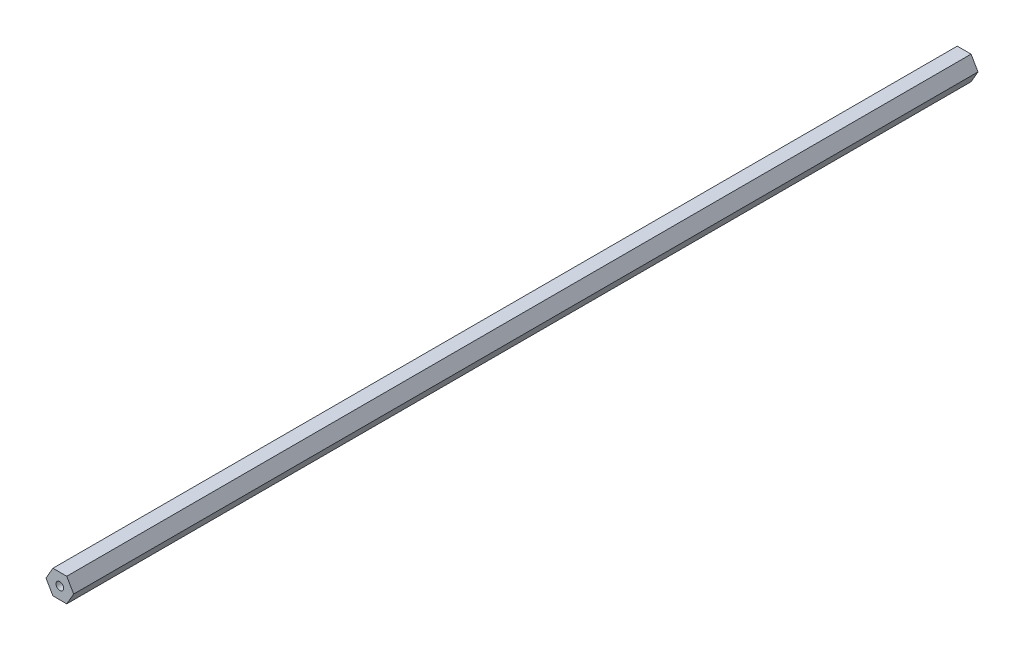
ISO-10303-21;
HEADER;
FILE_DESCRIPTION(('STEP AP214'),'2;1');
FILE_NAME('part.step','',(''),(''),'','','');
FILE_SCHEMA(('AUTOMOTIVE_DESIGN { 1 0 10303 214 1 1 1 1 }'));
ENDSEC;
DATA;
#1=APPLICATION_CONTEXT('core data for automotive mechanical design processes');
#2=APPLICATION_PROTOCOL_DEFINITION('international standard','automotive_design',2000,#1);
#3=PRODUCT_CONTEXT('',#1,'mechanical');
#4=PRODUCT('Part','Part','',(#3));
#5=PRODUCT_RELATED_PRODUCT_CATEGORY('part','',(#4));
#6=PRODUCT_DEFINITION_FORMATION('','',#4);
#7=PRODUCT_DEFINITION_CONTEXT('part definition',#1,'design');
#8=PRODUCT_DEFINITION('design','',#6,#7);
#9=PRODUCT_DEFINITION_SHAPE('','',#8);
#10=(LENGTH_UNIT() NAMED_UNIT(*) SI_UNIT(.MILLI.,.METRE.));
#11=(NAMED_UNIT(*) PLANE_ANGLE_UNIT() SI_UNIT($,.RADIAN.));
#12=(NAMED_UNIT(*) SI_UNIT($,.STERADIAN.) SOLID_ANGLE_UNIT());
#13=UNCERTAINTY_MEASURE_WITH_UNIT(LENGTH_MEASURE(1.E-05),#10,'distance_accuracy_value','');
#14=(GEOMETRIC_REPRESENTATION_CONTEXT(3) GLOBAL_UNCERTAINTY_ASSIGNED_CONTEXT((#13)) GLOBAL_UNIT_ASSIGNED_CONTEXT((#10,
#11,#12)) REPRESENTATION_CONTEXT('',''));
#15=CARTESIAN_POINT('',(0.,0.,0.));
#16=DIRECTION('',(0.,0.,1.));
#17=DIRECTION('',(1.,0.,0.));
#18=AXIS2_PLACEMENT_3D('',#15,#16,#17);
#19=CARTESIAN_POINT('',(0.,0.,479.425));
#20=DIRECTION('',(0.,0.,1.));
#21=DIRECTION('',(1.,0.,0.));
#22=AXIS2_PLACEMENT_3D('',#19,#20,#21);
#23=PLANE('',#22);
#24=DIRECTION('',(0.5,0.866025403784439,0.));
#25=VECTOR('',#24,1.);
#26=CARTESIAN_POINT('',(3.66617420935412,-6.35,479.425));
#27=LINE('',#26,#25);
#28=CARTESIAN_POINT('',(3.66617420935412,-6.35,479.425));
#29=VERTEX_POINT('',#28);
#30=CARTESIAN_POINT('',(7.33234841870825,0.,479.425));
#31=VERTEX_POINT('',#30);
#32=EDGE_CURVE('E129',#29,#31,#27,.T.);
#33=ORIENTED_EDGE('',*,*,#32,.T.);
#34=DIRECTION('',(-0.5,0.866025403784439,0.));
#35=VECTOR('',#34,1.);
#36=CARTESIAN_POINT('',(7.33234841870825,0.,479.425));
#37=LINE('',#36,#35);
#38=CARTESIAN_POINT('',(3.66617420935412,6.35,479.425));
#39=VERTEX_POINT('',#38);
#40=EDGE_CURVE('E87',#31,#39,#37,.T.);
#41=ORIENTED_EDGE('',*,*,#40,.T.);
#42=DIRECTION('',(-1.,0.,0.));
#43=VECTOR('',#42,1.);
#44=CARTESIAN_POINT('',(3.66617420935412,6.35,479.425));
#45=LINE('',#44,#43);
#46=CARTESIAN_POINT('',(-3.66617420935412,6.35,479.425));
#47=VERTEX_POINT('',#46);
#48=EDGE_CURVE('E100',#39,#47,#45,.T.);
#49=ORIENTED_EDGE('',*,*,#48,.T.);
#50=DIRECTION('',(-0.5,-0.866025403784439,0.));
#51=VECTOR('',#50,1.);
#52=CARTESIAN_POINT('',(-3.66617420935412,6.35,479.425));
#53=LINE('',#52,#51);
#54=CARTESIAN_POINT('',(-7.33234841870825,0.,479.425));
#55=VERTEX_POINT('',#54);
#56=EDGE_CURVE('E94',#47,#55,#53,.T.);
#57=ORIENTED_EDGE('',*,*,#56,.T.);
#58=DIRECTION('',(0.5,-0.866025403784439,0.));
#59=VECTOR('',#58,1.);
#60=CARTESIAN_POINT('',(-7.33234841870825,0.,479.425));
#61=LINE('',#60,#59);
#62=CARTESIAN_POINT('',(-3.66617420935412,-6.35,479.425));
#63=VERTEX_POINT('',#62);
#64=EDGE_CURVE('E98',#55,#63,#61,.T.);
#65=ORIENTED_EDGE('',*,*,#64,.T.);
#66=DIRECTION('',(1.,0.,0.));
#67=VECTOR('',#66,1.);
#68=CARTESIAN_POINT('',(-3.66617420935412,-6.35,479.425));
#69=LINE('',#68,#67);
#70=EDGE_CURVE('E50',#63,#29,#69,.T.);
#71=ORIENTED_EDGE('',*,*,#70,.T.);
#72=EDGE_LOOP('',(#33,#41,#49,#57,#65,#71));
#73=FACE_BOUND('',#72,.T.);
#74=CARTESIAN_POINT('',(0.,0.,479.425));
#75=DIRECTION('',(0.,0.,1.));
#76=DIRECTION('',(1.,0.,0.));
#77=AXIS2_PLACEMENT_3D('',#74,#75,#76);
#78=CIRCLE('',#77,2.0193);
#79=CARTESIAN_POINT('',(2.0193,0.,479.425));
#80=VERTEX_POINT('',#79);
#81=EDGE_CURVE('E122',#80,#80,#78,.T.);
#82=ORIENTED_EDGE('',*,*,#81,.F.);
#83=EDGE_LOOP('',(#82));
#84=FACE_BOUND('',#83,.T.);
#85=ADVANCED_FACE('F33',(#73,#84),#23,.T.);
#86=CARTESIAN_POINT('',(0.,0.,0.));
#87=DIRECTION('',(0.,0.,1.));
#88=DIRECTION('',(1.,0.,0.));
#89=AXIS2_PLACEMENT_3D('',#86,#87,#88);
#90=PLANE('',#89);
#91=DIRECTION('',(0.5,0.866025403784439,0.));
#92=VECTOR('',#91,1.);
#93=CARTESIAN_POINT('',(3.66617420935412,-6.35,0.));
#94=LINE('',#93,#92);
#95=CARTESIAN_POINT('',(3.66617420935412,-6.35,0.));
#96=VERTEX_POINT('',#95);
#97=CARTESIAN_POINT('',(7.33234841870825,0.,0.));
#98=VERTEX_POINT('',#97);
#99=EDGE_CURVE('E118',#96,#98,#94,.T.);
#100=ORIENTED_EDGE('',*,*,#99,.F.);
#101=DIRECTION('',(1.,0.,0.));
#102=VECTOR('',#101,1.);
#103=CARTESIAN_POINT('',(-3.66617420935412,-6.35,0.));
#104=LINE('',#103,#102);
#105=CARTESIAN_POINT('',(-3.66617420935412,-6.35,0.));
#106=VERTEX_POINT('',#105);
#107=EDGE_CURVE('E79',#106,#96,#104,.T.);
#108=ORIENTED_EDGE('',*,*,#107,.F.);
#109=DIRECTION('',(0.5,-0.866025403784439,0.));
#110=VECTOR('',#109,1.);
#111=CARTESIAN_POINT('',(-7.33234841870825,0.,0.));
#112=LINE('',#111,#110);
#113=CARTESIAN_POINT('',(-7.33234841870825,0.,0.));
#114=VERTEX_POINT('',#113);
#115=EDGE_CURVE('E73',#114,#106,#112,.T.);
#116=ORIENTED_EDGE('',*,*,#115,.F.);
#117=DIRECTION('',(-0.5,-0.866025403784439,0.));
#118=VECTOR('',#117,1.);
#119=CARTESIAN_POINT('',(-3.66617420935412,6.35,0.));
#120=LINE('',#119,#118);
#121=CARTESIAN_POINT('',(-3.66617420935412,6.35,0.));
#122=VERTEX_POINT('',#121);
#123=EDGE_CURVE('E108',#122,#114,#120,.T.);
#124=ORIENTED_EDGE('',*,*,#123,.F.);
#125=DIRECTION('',(-1.,0.,0.));
#126=VECTOR('',#125,1.);
#127=CARTESIAN_POINT('',(3.66617420935412,6.35,0.));
#128=LINE('',#127,#126);
#129=CARTESIAN_POINT('',(3.66617420935412,6.35,0.));
#130=VERTEX_POINT('',#129);
#131=EDGE_CURVE('E124',#130,#122,#128,.T.);
#132=ORIENTED_EDGE('',*,*,#131,.F.);
#133=DIRECTION('',(-0.5,0.866025403784439,0.));
#134=VECTOR('',#133,1.);
#135=CARTESIAN_POINT('',(7.33234841870825,0.,0.));
#136=LINE('',#135,#134);
#137=EDGE_CURVE('E121',#98,#130,#136,.T.);
#138=ORIENTED_EDGE('',*,*,#137,.F.);
#139=EDGE_LOOP('',(#100,#108,#116,#124,#132,#138));
#140=FACE_BOUND('',#139,.T.);
#141=CARTESIAN_POINT('',(0.,0.,0.));
#142=DIRECTION('',(0.,0.,1.));
#143=DIRECTION('',(1.,0.,0.));
#144=AXIS2_PLACEMENT_3D('',#141,#142,#143);
#145=CIRCLE('',#144,2.0193);
#146=CARTESIAN_POINT('',(2.0193,0.,0.));
#147=VERTEX_POINT('',#146);
#148=EDGE_CURVE('E222',#147,#147,#145,.T.);
#149=ORIENTED_EDGE('',*,*,#148,.T.);
#150=EDGE_LOOP('',(#149));
#151=FACE_BOUND('',#150,.T.);
#152=ADVANCED_FACE('F138',(#140,#151),#90,.F.);
#153=CARTESIAN_POINT('',(3.66617420935412,-6.35,479.425));
#154=DIRECTION('',(-0.866025403784439,0.5,0.));
#155=DIRECTION('',(-0.5,-0.866025403784439,0.));
#156=AXIS2_PLACEMENT_3D('',#153,#154,#155);
#157=PLANE('',#156);
#158=ORIENTED_EDGE('',*,*,#99,.T.);
#159=DIRECTION('',(0.,0.,-1.));
#160=VECTOR('',#159,1.);
#161=CARTESIAN_POINT('',(7.33234841870825,0.,479.425));
#162=LINE('',#161,#160);
#163=EDGE_CURVE('E11',#31,#98,#162,.T.);
#164=ORIENTED_EDGE('',*,*,#163,.F.);
#165=ORIENTED_EDGE('',*,*,#32,.F.);
#166=DIRECTION('',(0.,0.,-1.));
#167=VECTOR('',#166,1.);
#168=CARTESIAN_POINT('',(3.66617420935412,-6.35,479.425));
#169=LINE('',#168,#167);
#170=EDGE_CURVE('E114',#29,#96,#169,.T.);
#171=ORIENTED_EDGE('',*,*,#170,.T.);
#172=EDGE_LOOP('',(#158,#164,#165,#171));
#173=FACE_BOUND('',#172,.T.);
#174=ADVANCED_FACE('F35',(#173),#157,.F.);
#175=CARTESIAN_POINT('',(7.33234841870825,0.,479.425));
#176=DIRECTION('',(-0.866025403784438,-0.5,0.));
#177=DIRECTION('',(0.5,-0.866025403784439,0.));
#178=AXIS2_PLACEMENT_3D('',#175,#176,#177);
#179=PLANE('',#178);
#180=ORIENTED_EDGE('',*,*,#137,.T.);
#181=DIRECTION('',(0.,0.,-1.));
#182=VECTOR('',#181,1.);
#183=CARTESIAN_POINT('',(3.66617420935412,6.35,479.425));
#184=LINE('',#183,#182);
#185=EDGE_CURVE('E42',#39,#130,#184,.T.);
#186=ORIENTED_EDGE('',*,*,#185,.F.);
#187=ORIENTED_EDGE('',*,*,#40,.F.);
#188=ORIENTED_EDGE('',*,*,#163,.T.);
#189=EDGE_LOOP('',(#180,#186,#187,#188));
#190=FACE_BOUND('',#189,.T.);
#191=ADVANCED_FACE('F163',(#190),#179,.F.);
#192=CARTESIAN_POINT('',(3.66617420935412,6.35,479.425));
#193=DIRECTION('',(0.,-1.,0.));
#194=DIRECTION('',(0.,0.,-1.));
#195=AXIS2_PLACEMENT_3D('',#192,#193,#194);
#196=PLANE('',#195);
#197=ORIENTED_EDGE('',*,*,#131,.T.);
#198=DIRECTION('',(0.,0.,-1.));
#199=VECTOR('',#198,1.);
#200=CARTESIAN_POINT('',(-3.66617420935412,6.35,479.425));
#201=LINE('',#200,#199);
#202=EDGE_CURVE('E109',#47,#122,#201,.T.);
#203=ORIENTED_EDGE('',*,*,#202,.F.);
#204=ORIENTED_EDGE('',*,*,#48,.F.);
#205=ORIENTED_EDGE('',*,*,#185,.T.);
#206=EDGE_LOOP('',(#197,#203,#204,#205));
#207=FACE_BOUND('',#206,.T.);
#208=ADVANCED_FACE('F135',(#207),#196,.F.);
#209=CARTESIAN_POINT('',(-3.66617420935412,6.35,479.425));
#210=DIRECTION('',(0.866025403784439,-0.5,0.));
#211=DIRECTION('',(0.5,0.866025403784439,0.));
#212=AXIS2_PLACEMENT_3D('',#209,#210,#211);
#213=PLANE('',#212);
#214=ORIENTED_EDGE('',*,*,#123,.T.);
#215=DIRECTION('',(0.,0.,-1.));
#216=VECTOR('',#215,1.);
#217=CARTESIAN_POINT('',(-7.33234841870825,0.,479.425));
#218=LINE('',#217,#216);
#219=EDGE_CURVE('E105',#55,#114,#218,.T.);
#220=ORIENTED_EDGE('',*,*,#219,.F.);
#221=ORIENTED_EDGE('',*,*,#56,.F.);
#222=ORIENTED_EDGE('',*,*,#202,.T.);
#223=EDGE_LOOP('',(#214,#220,#221,#222));
#224=FACE_BOUND('',#223,.T.);
#225=ADVANCED_FACE('F106',(#224),#213,.F.);
#226=CARTESIAN_POINT('',(-7.33234841870825,0.,479.425));
#227=DIRECTION('',(0.866025403784439,0.5,0.));
#228=DIRECTION('',(-0.5,0.866025403784439,0.));
#229=AXIS2_PLACEMENT_3D('',#226,#227,#228);
#230=PLANE('',#229);
#231=ORIENTED_EDGE('',*,*,#115,.T.);
#232=DIRECTION('',(0.,0.,-1.));
#233=VECTOR('',#232,1.);
#234=CARTESIAN_POINT('',(-3.66617420935412,-6.35,479.425));
#235=LINE('',#234,#233);
#236=EDGE_CURVE('E110',#63,#106,#235,.T.);
#237=ORIENTED_EDGE('',*,*,#236,.F.);
#238=ORIENTED_EDGE('',*,*,#64,.F.);
#239=ORIENTED_EDGE('',*,*,#219,.T.);
#240=EDGE_LOOP('',(#231,#237,#238,#239));
#241=FACE_BOUND('',#240,.T.);
#242=ADVANCED_FACE('F112',(#241),#230,.F.);
#243=CARTESIAN_POINT('',(-3.66617420935412,-6.35,479.425));
#244=DIRECTION('',(0.,1.,0.));
#245=DIRECTION('',(0.,0.,1.));
#246=AXIS2_PLACEMENT_3D('',#243,#244,#245);
#247=PLANE('',#246);
#248=ORIENTED_EDGE('',*,*,#107,.T.);
#249=ORIENTED_EDGE('',*,*,#170,.F.);
#250=ORIENTED_EDGE('',*,*,#70,.F.);
#251=ORIENTED_EDGE('',*,*,#236,.T.);
#252=EDGE_LOOP('',(#248,#249,#250,#251));
#253=FACE_BOUND('',#252,.T.);
#254=ADVANCED_FACE('F143',(#253),#247,.F.);
#255=CARTESIAN_POINT('',(0.,0.,479.425));
#256=DIRECTION('',(0.,0.,-1.));
#257=DIRECTION('',(-1.,0.,0.));
#258=AXIS2_PLACEMENT_3D('',#255,#256,#257);
#259=CYLINDRICAL_SURFACE('',#258,2.0193);
#260=ORIENTED_EDGE('',*,*,#81,.T.);
#261=EDGE_LOOP('',(#260));
#262=FACE_BOUND('',#261,.T.);
#263=ORIENTED_EDGE('',*,*,#148,.F.);
#264=EDGE_LOOP('',(#263));
#265=FACE_BOUND('',#264,.T.);
#266=ADVANCED_FACE('F145',(#262,#265),#259,.F.);
#267=CLOSED_SHELL('',(#85,#152,#174,#191,#208,#225,#242,#254,#266));
#268=MANIFOLD_SOLID_BREP('B2',#267);
#269=ADVANCED_BREP_SHAPE_REPRESENTATION('',(#18,#268),#14);
#270=SHAPE_DEFINITION_REPRESENTATION(#9,#269);
ENDSEC;
END-ISO-10303-21;
